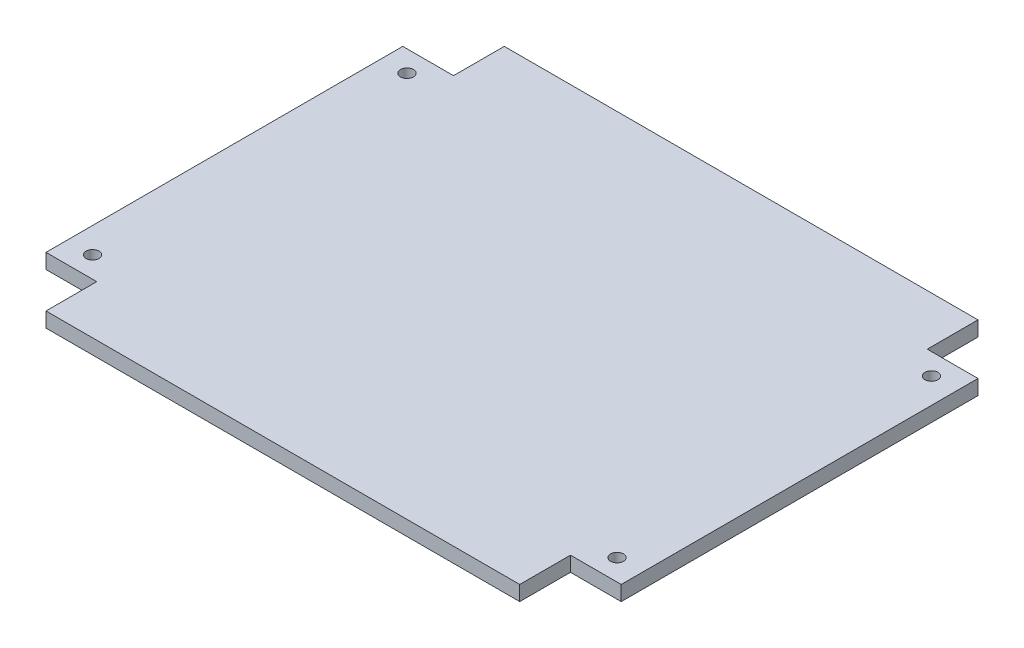
ISO-10303-21;
HEADER;
FILE_DESCRIPTION(('STEP AP214'),'2;1');
FILE_NAME('part.step','',(''),(''),'','','');
FILE_SCHEMA(('AUTOMOTIVE_DESIGN { 1 0 10303 214 1 1 1 1 }'));
ENDSEC;
DATA;
#1=APPLICATION_CONTEXT('core data for automotive mechanical design processes');
#2=APPLICATION_PROTOCOL_DEFINITION('international standard','automotive_design',2000,#1);
#3=PRODUCT_CONTEXT('',#1,'mechanical');
#4=PRODUCT('Part','Part','',(#3));
#5=PRODUCT_RELATED_PRODUCT_CATEGORY('part','',(#4));
#6=PRODUCT_DEFINITION_FORMATION('','',#4);
#7=PRODUCT_DEFINITION_CONTEXT('part definition',#1,'design');
#8=PRODUCT_DEFINITION('design','',#6,#7);
#9=PRODUCT_DEFINITION_SHAPE('','',#8);
#10=(LENGTH_UNIT() NAMED_UNIT(*) SI_UNIT(.MILLI.,.METRE.));
#11=(NAMED_UNIT(*) PLANE_ANGLE_UNIT() SI_UNIT($,.RADIAN.));
#12=(NAMED_UNIT(*) SI_UNIT($,.STERADIAN.) SOLID_ANGLE_UNIT());
#13=UNCERTAINTY_MEASURE_WITH_UNIT(LENGTH_MEASURE(1.E-05),#10,'distance_accuracy_value','');
#14=(GEOMETRIC_REPRESENTATION_CONTEXT(3) GLOBAL_UNCERTAINTY_ASSIGNED_CONTEXT((#13)) GLOBAL_UNIT_ASSIGNED_CONTEXT((#10,
#11,#12)) REPRESENTATION_CONTEXT('',''));
#15=CARTESIAN_POINT('',(0.,0.,0.));
#16=DIRECTION('',(0.,0.,1.));
#17=DIRECTION('',(1.,0.,0.));
#18=AXIS2_PLACEMENT_3D('',#15,#16,#17);
#19=CARTESIAN_POINT('',(-107.95,5.588,86.001599904));
#20=DIRECTION('',(1.,0.,0.));
#21=DIRECTION('',(0.,0.,-1.));
#22=AXIS2_PLACEMENT_3D('',#19,#20,#21);
#23=PLANE('',#22);
#24=DIRECTION('',(0.,0.,1.));
#25=VECTOR('',#24,1.);
#26=CARTESIAN_POINT('',(-107.95,0.,86.001599904));
#27=LINE('',#26,#25);
#28=CARTESIAN_POINT('',(-107.95,0.,-66.951599904));
#29=VERTEX_POINT('',#28);
#30=CARTESIAN_POINT('',(-107.95,0.,66.951599904));
#31=VERTEX_POINT('',#30);
#32=EDGE_CURVE('E145',#29,#31,#27,.T.);
#33=ORIENTED_EDGE('',*,*,#32,.T.);
#34=DIRECTION('',(0.,1.,0.));
#35=VECTOR('',#34,1.);
#36=CARTESIAN_POINT('',(-107.95,0.,66.951599904));
#37=LINE('',#36,#35);
#38=CARTESIAN_POINT('',(-107.95,5.588,66.951599904));
#39=VERTEX_POINT('',#38);
#40=EDGE_CURVE('E206',#31,#39,#37,.T.);
#41=ORIENTED_EDGE('',*,*,#40,.T.);
#42=DIRECTION('',(0.,0.,1.));
#43=VECTOR('',#42,1.);
#44=CARTESIAN_POINT('',(-107.95,5.588,86.001599904));
#45=LINE('',#44,#43);
#46=CARTESIAN_POINT('',(-107.95,5.588,-66.951599904));
#47=VERTEX_POINT('',#46);
#48=EDGE_CURVE('E153',#47,#39,#45,.T.);
#49=ORIENTED_EDGE('',*,*,#48,.F.);
#50=DIRECTION('',(0.,1.,0.));
#51=VECTOR('',#50,1.);
#52=CARTESIAN_POINT('',(-107.95,0.,-66.951599904));
#53=LINE('',#52,#51);
#54=EDGE_CURVE('E156',#29,#47,#53,.T.);
#55=ORIENTED_EDGE('',*,*,#54,.F.);
#56=EDGE_LOOP('',(#33,#41,#49,#55));
#57=FACE_BOUND('',#56,.T.);
#58=ADVANCED_FACE('F35',(#57),#23,.F.);
#59=CARTESIAN_POINT('',(107.95,5.588,86.001599904));
#60=DIRECTION('',(0.,0.,-1.));
#61=DIRECTION('',(-1.,0.,0.));
#62=AXIS2_PLACEMENT_3D('',#59,#60,#61);
#63=PLANE('',#62);
#64=DIRECTION('',(1.,0.,0.));
#65=VECTOR('',#64,1.);
#66=CARTESIAN_POINT('',(107.95,5.588,86.001599904));
#67=LINE('',#66,#65);
#68=CARTESIAN_POINT('',(-88.9,5.588,86.001599904));
#69=VERTEX_POINT('',#68);
#70=CARTESIAN_POINT('',(88.9,5.588,86.001599904));
#71=VERTEX_POINT('',#70);
#72=EDGE_CURVE('E140',#69,#71,#67,.T.);
#73=ORIENTED_EDGE('',*,*,#72,.F.);
#74=DIRECTION('',(0.,1.,0.));
#75=VECTOR('',#74,1.);
#76=CARTESIAN_POINT('',(-88.9,0.,86.001599904));
#77=LINE('',#76,#75);
#78=CARTESIAN_POINT('',(-88.9,0.,86.001599904));
#79=VERTEX_POINT('',#78);
#80=EDGE_CURVE('E128',#79,#69,#77,.T.);
#81=ORIENTED_EDGE('',*,*,#80,.F.);
#82=DIRECTION('',(1.,0.,0.));
#83=VECTOR('',#82,1.);
#84=CARTESIAN_POINT('',(107.95,0.,86.001599904));
#85=LINE('',#84,#83);
#86=CARTESIAN_POINT('',(88.9,0.,86.001599904));
#87=VERTEX_POINT('',#86);
#88=EDGE_CURVE('E139',#79,#87,#85,.T.);
#89=ORIENTED_EDGE('',*,*,#88,.T.);
#90=DIRECTION('',(0.,1.,0.));
#91=VECTOR('',#90,1.);
#92=CARTESIAN_POINT('',(88.9,0.,86.001599904));
#93=LINE('',#92,#91);
#94=EDGE_CURVE('E189',#87,#71,#93,.T.);
#95=ORIENTED_EDGE('',*,*,#94,.T.);
#96=EDGE_LOOP('',(#73,#81,#89,#95));
#97=FACE_BOUND('',#96,.T.);
#98=ADVANCED_FACE('F137',(#97),#63,.F.);
#99=CARTESIAN_POINT('',(107.95,5.588,86.001599904));
#100=DIRECTION('',(-1.,0.,0.));
#101=DIRECTION('',(0.,0.,1.));
#102=AXIS2_PLACEMENT_3D('',#99,#100,#101);
#103=PLANE('',#102);
#104=DIRECTION('',(0.,0.,-1.));
#105=VECTOR('',#104,1.);
#106=CARTESIAN_POINT('',(107.95,5.588,86.001599904));
#107=LINE('',#106,#105);
#108=CARTESIAN_POINT('',(107.95,5.588,66.951599904));
#109=VERTEX_POINT('',#108);
#110=CARTESIAN_POINT('',(107.95,5.588,-66.951599904));
#111=VERTEX_POINT('',#110);
#112=EDGE_CURVE('E43',#109,#111,#107,.T.);
#113=ORIENTED_EDGE('',*,*,#112,.F.);
#114=DIRECTION('',(0.,1.,0.));
#115=VECTOR('',#114,1.);
#116=CARTESIAN_POINT('',(107.95,0.,66.951599904));
#117=LINE('',#116,#115);
#118=CARTESIAN_POINT('',(107.95,0.,66.951599904));
#119=VERTEX_POINT('',#118);
#120=EDGE_CURVE('E194',#119,#109,#117,.T.);
#121=ORIENTED_EDGE('',*,*,#120,.F.);
#122=DIRECTION('',(0.,0.,-1.));
#123=VECTOR('',#122,1.);
#124=CARTESIAN_POINT('',(107.95,0.,86.001599904));
#125=LINE('',#124,#123);
#126=CARTESIAN_POINT('',(107.95,0.,-66.951599904));
#127=VERTEX_POINT('',#126);
#128=EDGE_CURVE('E144',#119,#127,#125,.T.);
#129=ORIENTED_EDGE('',*,*,#128,.T.);
#130=DIRECTION('',(0.,1.,0.));
#131=VECTOR('',#130,1.);
#132=CARTESIAN_POINT('',(107.95,0.,-66.951599904));
#133=LINE('',#132,#131);
#134=EDGE_CURVE('E170',#127,#111,#133,.T.);
#135=ORIENTED_EDGE('',*,*,#134,.T.);
#136=EDGE_LOOP('',(#113,#121,#129,#135));
#137=FACE_BOUND('',#136,.T.);
#138=ADVANCED_FACE('F290',(#137),#103,.F.);
#139=CARTESIAN_POINT('',(107.95,5.588,-86.001599904));
#140=DIRECTION('',(0.,0.,1.));
#141=DIRECTION('',(1.,0.,0.));
#142=AXIS2_PLACEMENT_3D('',#139,#140,#141);
#143=PLANE('',#142);
#144=DIRECTION('',(-1.,0.,0.));
#145=VECTOR('',#144,1.);
#146=CARTESIAN_POINT('',(107.95,5.588,-86.001599904));
#147=LINE('',#146,#145);
#148=CARTESIAN_POINT('',(88.9,5.588,-86.001599904));
#149=VERTEX_POINT('',#148);
#150=CARTESIAN_POINT('',(-88.9,5.588,-86.001599904));
#151=VERTEX_POINT('',#150);
#152=EDGE_CURVE('E11',#149,#151,#147,.T.);
#153=ORIENTED_EDGE('',*,*,#152,.F.);
#154=DIRECTION('',(0.,1.,0.));
#155=VECTOR('',#154,1.);
#156=CARTESIAN_POINT('',(88.9,0.,-86.001599904));
#157=LINE('',#156,#155);
#158=CARTESIAN_POINT('',(88.9,0.,-86.001599904));
#159=VERTEX_POINT('',#158);
#160=EDGE_CURVE('E175',#159,#149,#157,.T.);
#161=ORIENTED_EDGE('',*,*,#160,.F.);
#162=DIRECTION('',(-1.,0.,0.));
#163=VECTOR('',#162,1.);
#164=CARTESIAN_POINT('',(107.95,0.,-86.001599904));
#165=LINE('',#164,#163);
#166=CARTESIAN_POINT('',(-88.9,0.,-86.001599904));
#167=VERTEX_POINT('',#166);
#168=EDGE_CURVE('E38',#159,#167,#165,.T.);
#169=ORIENTED_EDGE('',*,*,#168,.T.);
#170=DIRECTION('',(0.,1.,0.));
#171=VECTOR('',#170,1.);
#172=CARTESIAN_POINT('',(-88.9,0.,-86.001599904));
#173=LINE('',#172,#171);
#174=EDGE_CURVE('E148',#167,#151,#173,.T.);
#175=ORIENTED_EDGE('',*,*,#174,.T.);
#176=EDGE_LOOP('',(#153,#161,#169,#175));
#177=FACE_BOUND('',#176,.T.);
#178=ADVANCED_FACE('F253',(#177),#143,.F.);
#179=CARTESIAN_POINT('',(0.,5.588,0.));
#180=DIRECTION('',(0.,1.,0.));
#181=DIRECTION('',(0.,0.,1.));
#182=AXIS2_PLACEMENT_3D('',#179,#180,#181);
#183=PLANE('',#182);
#184=CARTESIAN_POINT('',(98.425,5.588,-59.014099904));
#185=DIRECTION('',(0.,1.,0.));
#186=DIRECTION('',(0.,0.,1.));
#187=AXIS2_PLACEMENT_3D('',#184,#185,#186);
#188=CIRCLE('',#187,2.4257);
#189=CARTESIAN_POINT('',(98.425,5.588,-56.588399904));
#190=VERTEX_POINT('',#189);
#191=EDGE_CURVE('E235',#190,#190,#188,.T.);
#192=ORIENTED_EDGE('',*,*,#191,.F.);
#193=EDGE_LOOP('',(#192));
#194=FACE_BOUND('',#193,.T.);
#195=CARTESIAN_POINT('',(98.425,5.588,59.014099904));
#196=DIRECTION('',(0.,1.,0.));
#197=DIRECTION('',(0.,0.,1.));
#198=AXIS2_PLACEMENT_3D('',#195,#196,#197);
#199=CIRCLE('',#198,2.4257);
#200=CARTESIAN_POINT('',(98.425,5.588,61.439799904));
#201=VERTEX_POINT('',#200);
#202=EDGE_CURVE('E229',#201,#201,#199,.T.);
#203=ORIENTED_EDGE('',*,*,#202,.F.);
#204=EDGE_LOOP('',(#203));
#205=FACE_BOUND('',#204,.T.);
#206=CARTESIAN_POINT('',(-98.425,5.588,59.014099904));
#207=DIRECTION('',(0.,1.,0.));
#208=DIRECTION('',(0.,0.,1.));
#209=AXIS2_PLACEMENT_3D('',#206,#207,#208);
#210=CIRCLE('',#209,2.4257);
#211=CARTESIAN_POINT('',(-98.425,5.588,61.439799904));
#212=VERTEX_POINT('',#211);
#213=EDGE_CURVE('E223',#212,#212,#210,.T.);
#214=ORIENTED_EDGE('',*,*,#213,.F.);
#215=EDGE_LOOP('',(#214));
#216=FACE_BOUND('',#215,.T.);
#217=CARTESIAN_POINT('',(-98.425,5.588,-59.014099904));
#218=DIRECTION('',(0.,1.,0.));
#219=DIRECTION('',(0.,0.,1.));
#220=AXIS2_PLACEMENT_3D('',#217,#218,#219);
#221=CIRCLE('',#220,2.4257);
#222=CARTESIAN_POINT('',(-98.425,5.588,-56.588399904));
#223=VERTEX_POINT('',#222);
#224=EDGE_CURVE('E217',#223,#223,#221,.T.);
#225=ORIENTED_EDGE('',*,*,#224,.F.);
#226=EDGE_LOOP('',(#225));
#227=FACE_BOUND('',#226,.T.);
#228=DIRECTION('',(-1.,0.,0.));
#229=VECTOR('',#228,1.);
#230=CARTESIAN_POINT('',(-107.95,5.588,66.951599904));
#231=LINE('',#230,#229);
#232=CARTESIAN_POINT('',(-88.9,5.588,66.951599904));
#233=VERTEX_POINT('',#232);
#234=EDGE_CURVE('E133',#233,#39,#231,.T.);
#235=ORIENTED_EDGE('',*,*,#234,.F.);
#236=DIRECTION('',(0.,0.,-1.));
#237=VECTOR('',#236,1.);
#238=CARTESIAN_POINT('',(-88.9,5.588,86.001599904));
#239=LINE('',#238,#237);
#240=EDGE_CURVE('E213',#69,#233,#239,.T.);
#241=ORIENTED_EDGE('',*,*,#240,.F.);
#242=ORIENTED_EDGE('',*,*,#72,.T.);
#243=DIRECTION('',(0.,0.,1.));
#244=VECTOR('',#243,1.);
#245=CARTESIAN_POINT('',(88.9,5.588,86.001599904));
#246=LINE('',#245,#244);
#247=CARTESIAN_POINT('',(88.9,5.588,66.951599904));
#248=VERTEX_POINT('',#247);
#249=EDGE_CURVE('E199',#248,#71,#246,.T.);
#250=ORIENTED_EDGE('',*,*,#249,.F.);
#251=DIRECTION('',(-1.,0.,0.));
#252=VECTOR('',#251,1.);
#253=CARTESIAN_POINT('',(107.95,5.588,66.951599904));
#254=LINE('',#253,#252);
#255=EDGE_CURVE('E203',#109,#248,#254,.T.);
#256=ORIENTED_EDGE('',*,*,#255,.F.);
#257=ORIENTED_EDGE('',*,*,#112,.T.);
#258=DIRECTION('',(1.,0.,0.));
#259=VECTOR('',#258,1.);
#260=CARTESIAN_POINT('',(107.95,5.588,-66.951599904));
#261=LINE('',#260,#259);
#262=CARTESIAN_POINT('',(88.9,5.588,-66.951599904));
#263=VERTEX_POINT('',#262);
#264=EDGE_CURVE('E182',#263,#111,#261,.T.);
#265=ORIENTED_EDGE('',*,*,#264,.F.);
#266=DIRECTION('',(0.,0.,1.));
#267=VECTOR('',#266,1.);
#268=CARTESIAN_POINT('',(88.9,5.588,-86.001599904));
#269=LINE('',#268,#267);
#270=EDGE_CURVE('E186',#149,#263,#269,.T.);
#271=ORIENTED_EDGE('',*,*,#270,.F.);
#272=ORIENTED_EDGE('',*,*,#152,.T.);
#273=DIRECTION('',(0.,0.,-1.));
#274=VECTOR('',#273,1.);
#275=CARTESIAN_POINT('',(-88.9,5.588,-86.001599904));
#276=LINE('',#275,#274);
#277=CARTESIAN_POINT('',(-88.9,5.588,-66.951599904));
#278=VERTEX_POINT('',#277);
#279=EDGE_CURVE('E163',#278,#151,#276,.T.);
#280=ORIENTED_EDGE('',*,*,#279,.F.);
#281=DIRECTION('',(1.,0.,0.));
#282=VECTOR('',#281,1.);
#283=CARTESIAN_POINT('',(-107.95,5.588,-66.951599904));
#284=LINE('',#283,#282);
#285=EDGE_CURVE('E167',#47,#278,#284,.T.);
#286=ORIENTED_EDGE('',*,*,#285,.F.);
#287=ORIENTED_EDGE('',*,*,#48,.T.);
#288=EDGE_LOOP('',(#235,#241,#242,#250,#256,#257,#265,#271,#272,#280,#286,#287));
#289=FACE_BOUND('',#288,.T.);
#290=ADVANCED_FACE('F250',(#194,#205,#216,#227,#289),#183,.T.);
#291=CARTESIAN_POINT('',(0.,0.,0.));
#292=DIRECTION('',(0.,1.,0.));
#293=DIRECTION('',(0.,0.,1.));
#294=AXIS2_PLACEMENT_3D('',#291,#292,#293);
#295=PLANE('',#294);
#296=CARTESIAN_POINT('',(98.425,0.,-59.014099904));
#297=DIRECTION('',(0.,1.,0.));
#298=DIRECTION('',(0.,0.,1.));
#299=AXIS2_PLACEMENT_3D('',#296,#297,#298);
#300=CIRCLE('',#299,2.4257);
#301=CARTESIAN_POINT('',(98.425,0.,-56.588399904));
#302=VERTEX_POINT('',#301);
#303=EDGE_CURVE('E232',#302,#302,#300,.T.);
#304=ORIENTED_EDGE('',*,*,#303,.T.);
#305=EDGE_LOOP('',(#304));
#306=FACE_BOUND('',#305,.T.);
#307=CARTESIAN_POINT('',(98.425,0.,59.014099904));
#308=DIRECTION('',(0.,1.,0.));
#309=DIRECTION('',(0.,0.,1.));
#310=AXIS2_PLACEMENT_3D('',#307,#308,#309);
#311=CIRCLE('',#310,2.4257);
#312=CARTESIAN_POINT('',(98.425,0.,61.439799904));
#313=VERTEX_POINT('',#312);
#314=EDGE_CURVE('E226',#313,#313,#311,.T.);
#315=ORIENTED_EDGE('',*,*,#314,.T.);
#316=EDGE_LOOP('',(#315));
#317=FACE_BOUND('',#316,.T.);
#318=CARTESIAN_POINT('',(-98.425,0.,59.014099904));
#319=DIRECTION('',(0.,1.,0.));
#320=DIRECTION('',(0.,0.,1.));
#321=AXIS2_PLACEMENT_3D('',#318,#319,#320);
#322=CIRCLE('',#321,2.4257);
#323=CARTESIAN_POINT('',(-98.425,0.,61.439799904));
#324=VERTEX_POINT('',#323);
#325=EDGE_CURVE('E220',#324,#324,#322,.T.);
#326=ORIENTED_EDGE('',*,*,#325,.T.);
#327=EDGE_LOOP('',(#326));
#328=FACE_BOUND('',#327,.T.);
#329=CARTESIAN_POINT('',(-98.425,0.,-59.014099904));
#330=DIRECTION('',(0.,1.,0.));
#331=DIRECTION('',(0.,0.,1.));
#332=AXIS2_PLACEMENT_3D('',#329,#330,#331);
#333=CIRCLE('',#332,2.4257);
#334=CARTESIAN_POINT('',(-98.425,0.,-56.588399904));
#335=VERTEX_POINT('',#334);
#336=EDGE_CURVE('E215',#335,#335,#333,.T.);
#337=ORIENTED_EDGE('',*,*,#336,.T.);
#338=EDGE_LOOP('',(#337));
#339=FACE_BOUND('',#338,.T.);
#340=DIRECTION('',(0.,0.,-1.));
#341=VECTOR('',#340,1.);
#342=CARTESIAN_POINT('',(-88.9,0.,86.001599904));
#343=LINE('',#342,#341);
#344=CARTESIAN_POINT('',(-88.9,0.,66.951599904));
#345=VERTEX_POINT('',#344);
#346=EDGE_CURVE('E124',#79,#345,#343,.T.);
#347=ORIENTED_EDGE('',*,*,#346,.T.);
#348=DIRECTION('',(-1.,0.,0.));
#349=VECTOR('',#348,1.);
#350=CARTESIAN_POINT('',(-107.95,0.,66.951599904));
#351=LINE('',#350,#349);
#352=EDGE_CURVE('E51',#345,#31,#351,.T.);
#353=ORIENTED_EDGE('',*,*,#352,.T.);
#354=ORIENTED_EDGE('',*,*,#32,.F.);
#355=DIRECTION('',(1.,0.,0.));
#356=VECTOR('',#355,1.);
#357=CARTESIAN_POINT('',(-107.95,0.,-66.951599904));
#358=LINE('',#357,#356);
#359=CARTESIAN_POINT('',(-88.9,0.,-66.951599904));
#360=VERTEX_POINT('',#359);
#361=EDGE_CURVE('E166',#29,#360,#358,.T.);
#362=ORIENTED_EDGE('',*,*,#361,.T.);
#363=DIRECTION('',(0.,0.,-1.));
#364=VECTOR('',#363,1.);
#365=CARTESIAN_POINT('',(-88.9,0.,-86.001599904));
#366=LINE('',#365,#364);
#367=EDGE_CURVE('E159',#360,#167,#366,.T.);
#368=ORIENTED_EDGE('',*,*,#367,.T.);
#369=ORIENTED_EDGE('',*,*,#168,.F.);
#370=DIRECTION('',(0.,0.,1.));
#371=VECTOR('',#370,1.);
#372=CARTESIAN_POINT('',(88.9,0.,-86.001599904));
#373=LINE('',#372,#371);
#374=CARTESIAN_POINT('',(88.9,0.,-66.951599904));
#375=VERTEX_POINT('',#374);
#376=EDGE_CURVE('E185',#159,#375,#373,.T.);
#377=ORIENTED_EDGE('',*,*,#376,.T.);
#378=DIRECTION('',(1.,0.,0.));
#379=VECTOR('',#378,1.);
#380=CARTESIAN_POINT('',(107.95,0.,-66.951599904));
#381=LINE('',#380,#379);
#382=EDGE_CURVE('E178',#375,#127,#381,.T.);
#383=ORIENTED_EDGE('',*,*,#382,.T.);
#384=ORIENTED_EDGE('',*,*,#128,.F.);
#385=DIRECTION('',(-1.,0.,0.));
#386=VECTOR('',#385,1.);
#387=CARTESIAN_POINT('',(107.95,0.,66.951599904));
#388=LINE('',#387,#386);
#389=CARTESIAN_POINT('',(88.9,0.,66.951599904));
#390=VERTEX_POINT('',#389);
#391=EDGE_CURVE('E202',#119,#390,#388,.T.);
#392=ORIENTED_EDGE('',*,*,#391,.T.);
#393=DIRECTION('',(0.,0.,1.));
#394=VECTOR('',#393,1.);
#395=CARTESIAN_POINT('',(88.9,0.,86.001599904));
#396=LINE('',#395,#394);
#397=EDGE_CURVE('E59',#390,#87,#396,.T.);
#398=ORIENTED_EDGE('',*,*,#397,.T.);
#399=ORIENTED_EDGE('',*,*,#88,.F.);
#400=EDGE_LOOP('',(#347,#353,#354,#362,#368,#369,#377,#383,#384,#392,#398,#399));
#401=FACE_BOUND('',#400,.T.);
#402=ADVANCED_FACE('F142',(#306,#317,#328,#339,#401),#295,.F.);
#403=CARTESIAN_POINT('',(-88.9,0.,-86.001599904));
#404=DIRECTION('',(1.,0.,0.));
#405=DIRECTION('',(0.,0.,-1.));
#406=AXIS2_PLACEMENT_3D('',#403,#404,#405);
#407=PLANE('',#406);
#408=ORIENTED_EDGE('',*,*,#279,.T.);
#409=ORIENTED_EDGE('',*,*,#174,.F.);
#410=ORIENTED_EDGE('',*,*,#367,.F.);
#411=DIRECTION('',(0.,1.,0.));
#412=VECTOR('',#411,1.);
#413=CARTESIAN_POINT('',(-88.9,0.,-66.951599904));
#414=LINE('',#413,#412);
#415=EDGE_CURVE('E158',#360,#278,#414,.T.);
#416=ORIENTED_EDGE('',*,*,#415,.T.);
#417=EDGE_LOOP('',(#408,#409,#410,#416));
#418=FACE_BOUND('',#417,.T.);
#419=ADVANCED_FACE('F274',(#418),#407,.F.);
#420=CARTESIAN_POINT('',(-107.95,0.,-66.951599904));
#421=DIRECTION('',(0.,0.,1.));
#422=DIRECTION('',(1.,0.,0.));
#423=AXIS2_PLACEMENT_3D('',#420,#421,#422);
#424=PLANE('',#423);
#425=ORIENTED_EDGE('',*,*,#285,.T.);
#426=ORIENTED_EDGE('',*,*,#415,.F.);
#427=ORIENTED_EDGE('',*,*,#361,.F.);
#428=ORIENTED_EDGE('',*,*,#54,.T.);
#429=EDGE_LOOP('',(#425,#426,#427,#428));
#430=FACE_BOUND('',#429,.T.);
#431=ADVANCED_FACE('F271',(#430),#424,.F.);
#432=CARTESIAN_POINT('',(107.95,0.,-66.951599904));
#433=DIRECTION('',(0.,0.,1.));
#434=DIRECTION('',(1.,0.,0.));
#435=AXIS2_PLACEMENT_3D('',#432,#433,#434);
#436=PLANE('',#435);
#437=ORIENTED_EDGE('',*,*,#264,.T.);
#438=ORIENTED_EDGE('',*,*,#134,.F.);
#439=ORIENTED_EDGE('',*,*,#382,.F.);
#440=DIRECTION('',(0.,1.,0.));
#441=VECTOR('',#440,1.);
#442=CARTESIAN_POINT('',(88.9,0.,-66.951599904));
#443=LINE('',#442,#441);
#444=EDGE_CURVE('E177',#375,#263,#443,.T.);
#445=ORIENTED_EDGE('',*,*,#444,.T.);
#446=EDGE_LOOP('',(#437,#438,#439,#445));
#447=FACE_BOUND('',#446,.T.);
#448=ADVANCED_FACE('F286',(#447),#436,.F.);
#449=CARTESIAN_POINT('',(88.9,0.,-86.001599904));
#450=DIRECTION('',(-1.,0.,0.));
#451=DIRECTION('',(0.,0.,1.));
#452=AXIS2_PLACEMENT_3D('',#449,#450,#451);
#453=PLANE('',#452);
#454=ORIENTED_EDGE('',*,*,#270,.T.);
#455=ORIENTED_EDGE('',*,*,#444,.F.);
#456=ORIENTED_EDGE('',*,*,#376,.F.);
#457=ORIENTED_EDGE('',*,*,#160,.T.);
#458=EDGE_LOOP('',(#454,#455,#456,#457));
#459=FACE_BOUND('',#458,.T.);
#460=ADVANCED_FACE('F282',(#459),#453,.F.);
#461=CARTESIAN_POINT('',(88.9,0.,86.001599904));
#462=DIRECTION('',(-1.,0.,0.));
#463=DIRECTION('',(0.,0.,1.));
#464=AXIS2_PLACEMENT_3D('',#461,#462,#463);
#465=PLANE('',#464);
#466=ORIENTED_EDGE('',*,*,#249,.T.);
#467=ORIENTED_EDGE('',*,*,#94,.F.);
#468=ORIENTED_EDGE('',*,*,#397,.F.);
#469=DIRECTION('',(0.,1.,0.));
#470=VECTOR('',#469,1.);
#471=CARTESIAN_POINT('',(88.9,0.,66.951599904));
#472=LINE('',#471,#470);
#473=EDGE_CURVE('E196',#390,#248,#472,.T.);
#474=ORIENTED_EDGE('',*,*,#473,.T.);
#475=EDGE_LOOP('',(#466,#467,#468,#474));
#476=FACE_BOUND('',#475,.T.);
#477=ADVANCED_FACE('F296',(#476),#465,.F.);
#478=CARTESIAN_POINT('',(107.95,0.,66.951599904));
#479=DIRECTION('',(0.,0.,-1.));
#480=DIRECTION('',(-1.,0.,0.));
#481=AXIS2_PLACEMENT_3D('',#478,#479,#480);
#482=PLANE('',#481);
#483=ORIENTED_EDGE('',*,*,#255,.T.);
#484=ORIENTED_EDGE('',*,*,#473,.F.);
#485=ORIENTED_EDGE('',*,*,#391,.F.);
#486=ORIENTED_EDGE('',*,*,#120,.T.);
#487=EDGE_LOOP('',(#483,#484,#485,#486));
#488=FACE_BOUND('',#487,.T.);
#489=ADVANCED_FACE('F293',(#488),#482,.F.);
#490=CARTESIAN_POINT('',(-107.95,0.,66.951599904));
#491=DIRECTION('',(0.,0.,-1.));
#492=DIRECTION('',(-1.,0.,0.));
#493=AXIS2_PLACEMENT_3D('',#490,#491,#492);
#494=PLANE('',#493);
#495=ORIENTED_EDGE('',*,*,#234,.T.);
#496=ORIENTED_EDGE('',*,*,#40,.F.);
#497=ORIENTED_EDGE('',*,*,#352,.F.);
#498=DIRECTION('',(0.,1.,0.));
#499=VECTOR('',#498,1.);
#500=CARTESIAN_POINT('',(-88.9,0.,66.951599904));
#501=LINE('',#500,#499);
#502=EDGE_CURVE('E130',#345,#233,#501,.T.);
#503=ORIENTED_EDGE('',*,*,#502,.T.);
#504=EDGE_LOOP('',(#495,#496,#497,#503));
#505=FACE_BOUND('',#504,.T.);
#506=ADVANCED_FACE('F264',(#505),#494,.F.);
#507=CARTESIAN_POINT('',(-88.9,0.,86.001599904));
#508=DIRECTION('',(1.,0.,0.));
#509=DIRECTION('',(0.,0.,-1.));
#510=AXIS2_PLACEMENT_3D('',#507,#508,#509);
#511=PLANE('',#510);
#512=ORIENTED_EDGE('',*,*,#240,.T.);
#513=ORIENTED_EDGE('',*,*,#502,.F.);
#514=ORIENTED_EDGE('',*,*,#346,.F.);
#515=ORIENTED_EDGE('',*,*,#80,.T.);
#516=EDGE_LOOP('',(#512,#513,#514,#515));
#517=FACE_BOUND('',#516,.T.);
#518=ADVANCED_FACE('F127',(#517),#511,.F.);
#519=CARTESIAN_POINT('',(-98.425,0.,-59.014099904));
#520=DIRECTION('',(0.,1.,0.));
#521=DIRECTION('',(0.,0.,1.));
#522=AXIS2_PLACEMENT_3D('',#519,#520,#521);
#523=CYLINDRICAL_SURFACE('',#522,2.4257);
#524=ORIENTED_EDGE('',*,*,#336,.F.);
#525=EDGE_LOOP('',(#524));
#526=FACE_BOUND('',#525,.T.);
#527=ORIENTED_EDGE('',*,*,#224,.T.);
#528=EDGE_LOOP('',(#527));
#529=FACE_BOUND('',#528,.T.);
#530=ADVANCED_FACE('F359',(#526,#529),#523,.F.);
#531=CARTESIAN_POINT('',(-98.425,0.,59.014099904));
#532=DIRECTION('',(0.,1.,0.));
#533=DIRECTION('',(0.,0.,1.));
#534=AXIS2_PLACEMENT_3D('',#531,#532,#533);
#535=CYLINDRICAL_SURFACE('',#534,2.4257);
#536=ORIENTED_EDGE('',*,*,#325,.F.);
#537=EDGE_LOOP('',(#536));
#538=FACE_BOUND('',#537,.T.);
#539=ORIENTED_EDGE('',*,*,#213,.T.);
#540=EDGE_LOOP('',(#539));
#541=FACE_BOUND('',#540,.T.);
#542=ADVANCED_FACE('F381',(#538,#541),#535,.F.);
#543=CARTESIAN_POINT('',(98.425,0.,59.014099904));
#544=DIRECTION('',(0.,1.,0.));
#545=DIRECTION('',(0.,0.,1.));
#546=AXIS2_PLACEMENT_3D('',#543,#544,#545);
#547=CYLINDRICAL_SURFACE('',#546,2.4257);
#548=ORIENTED_EDGE('',*,*,#314,.F.);
#549=EDGE_LOOP('',(#548));
#550=FACE_BOUND('',#549,.T.);
#551=ORIENTED_EDGE('',*,*,#202,.T.);
#552=EDGE_LOOP('',(#551));
#553=FACE_BOUND('',#552,.T.);
#554=ADVANCED_FACE('F246',(#550,#553),#547,.F.);
#555=CARTESIAN_POINT('',(98.425,0.,-59.014099904));
#556=DIRECTION('',(0.,1.,0.));
#557=DIRECTION('',(0.,0.,1.));
#558=AXIS2_PLACEMENT_3D('',#555,#556,#557);
#559=CYLINDRICAL_SURFACE('',#558,2.4257);
#560=ORIENTED_EDGE('',*,*,#303,.F.);
#561=EDGE_LOOP('',(#560));
#562=FACE_BOUND('',#561,.T.);
#563=ORIENTED_EDGE('',*,*,#191,.T.);
#564=EDGE_LOOP('',(#563));
#565=FACE_BOUND('',#564,.T.);
#566=ADVANCED_FACE('F243',(#562,#565),#559,.F.);
#567=CLOSED_SHELL('',(#58,#98,#138,#178,#290,#402,#419,#431,#448,#460,#477,#489,#506,#518,#530,
#542,#554,#566));
#568=MANIFOLD_SOLID_BREP('B2',#567);
#569=ADVANCED_BREP_SHAPE_REPRESENTATION('',(#18,#568),#14);
#570=SHAPE_DEFINITION_REPRESENTATION(#9,#569);
ENDSEC;
END-ISO-10303-21;
